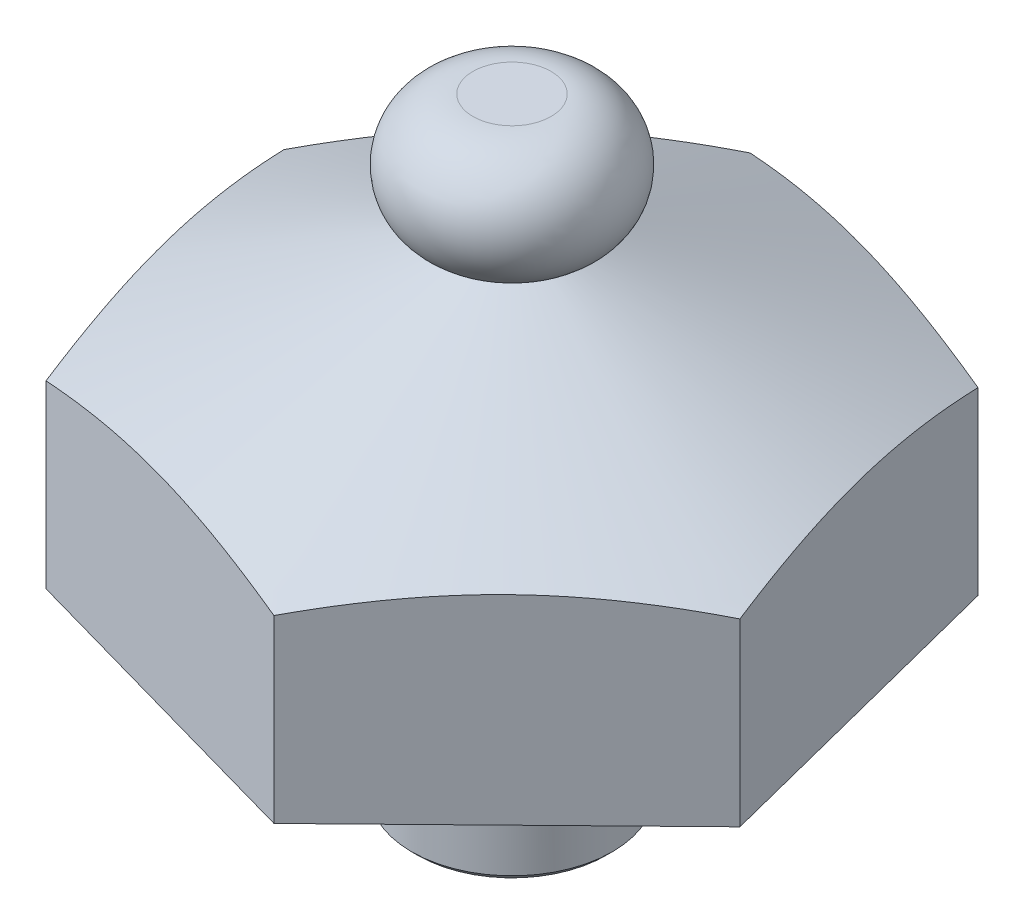
ISO-10303-21;
HEADER;
FILE_DESCRIPTION(('STEP AP214'),'2;1');
FILE_NAME('part.step','',(''),(''),'','','');
FILE_SCHEMA(('AUTOMOTIVE_DESIGN { 1 0 10303 214 1 1 1 1 }'));
ENDSEC;
DATA;
#1=APPLICATION_CONTEXT('core data for automotive mechanical design processes');
#2=APPLICATION_PROTOCOL_DEFINITION('international standard','automotive_design',2000,#1);
#3=PRODUCT_CONTEXT('',#1,'mechanical');
#4=PRODUCT('Part','Part','',(#3));
#5=PRODUCT_RELATED_PRODUCT_CATEGORY('part','',(#4));
#6=PRODUCT_DEFINITION_FORMATION('','',#4);
#7=PRODUCT_DEFINITION_CONTEXT('part definition',#1,'design');
#8=PRODUCT_DEFINITION('design','',#6,#7);
#9=PRODUCT_DEFINITION_SHAPE('','',#8);
#10=(LENGTH_UNIT() NAMED_UNIT(*) SI_UNIT(.MILLI.,.METRE.));
#11=(NAMED_UNIT(*) PLANE_ANGLE_UNIT() SI_UNIT($,.RADIAN.));
#12=(NAMED_UNIT(*) SI_UNIT($,.STERADIAN.) SOLID_ANGLE_UNIT());
#13=UNCERTAINTY_MEASURE_WITH_UNIT(LENGTH_MEASURE(1.E-05),#10,'distance_accuracy_value','');
#14=(GEOMETRIC_REPRESENTATION_CONTEXT(3) GLOBAL_UNCERTAINTY_ASSIGNED_CONTEXT((#13)) GLOBAL_UNIT_ASSIGNED_CONTEXT((#10,
#11,#12)) REPRESENTATION_CONTEXT('',''));
#15=CARTESIAN_POINT('',(0.,0.,0.));
#16=DIRECTION('',(0.,0.,1.));
#17=DIRECTION('',(1.,0.,0.));
#18=AXIS2_PLACEMENT_3D('',#15,#16,#17);
#19=CARTESIAN_POINT('',(0.,80.,0.));
#20=DIRECTION('',(0.,-1.,0.));
#21=DIRECTION('',(0.,0.,-1.));
#22=AXIS2_PLACEMENT_3D('',#19,#20,#21);
#23=CONICAL_SURFACE('',#22,6.38002773925106,1.1530604374243);
#24=CARTESIAN_POINT('',(0.,80.,0.));
#25=DIRECTION('',(0.,-1.,0.));
#26=DIRECTION('',(0.,0.,-1.));
#27=AXIS2_PLACEMENT_3D('',#24,#25,#26);
#28=CIRCLE('',#27,6.38002773925106);
#29=CARTESIAN_POINT('',(0.,80.,-6.38002773925106));
#30=VERTEX_POINT('',#29);
#31=EDGE_CURVE('E227',#30,#30,#28,.T.);
#32=ORIENTED_EDGE('',*,*,#31,.T.);
#33=EDGE_LOOP('',(#32));
#34=FACE_BOUND('',#33,.T.);
#35=CARTESIAN_POINT('',(-38.5272106001434,58.945862659129,37.5716324997342));
#36=CARTESIAN_POINT('',(-38.9490929836767,59.3254479113093,35.9141508952983));
#37=CARTESIAN_POINT('',(-39.3724986280625,59.6792666438576,34.250684739385));
#38=CARTESIAN_POINT('',(-40.2223538204007,60.32617826813,30.9117936106836));
#39=CARTESIAN_POINT('',(-40.6488049309337,60.6192372617237,29.2363624988654));
#40=CARTESIAN_POINT('',(-41.2905378575455,61.0061313484562,26.7151372419315));
#41=CARTESIAN_POINT('',(-41.5048558304006,61.1263416547713,25.8731298214454));
#42=CARTESIAN_POINT('',(-41.9340772011134,61.3480465442147,24.1868149764668));
#43=CARTESIAN_POINT('',(-42.1489805833613,61.4495416215165,23.3425076133015));
#44=CARTESIAN_POINT('',(-42.5792629747179,61.6327830320595,21.6520242553259));
#45=CARTESIAN_POINT('',(-42.794641895526,61.7145327639283,20.8058486074289));
#46=CARTESIAN_POINT('',(-43.2258161055738,61.8574299318329,19.111861493115));
#47=CARTESIAN_POINT('',(-43.4416113934293,61.9185774362494,18.2640500321369));
#48=CARTESIAN_POINT('',(-43.8693163493233,62.0185992769069,16.5836928420994));
#49=CARTESIAN_POINT('',(-44.0812201827814,62.0578826942146,15.7511700358028));
#50=CARTESIAN_POINT('',(-44.5052015381852,62.1155309799565,14.0854420399571));
#51=CARTESIAN_POINT('',(-44.7172790600562,62.1338958573776,13.2522368507014));
#52=CARTESIAN_POINT('',(-45.1414964689463,62.1494953718071,11.5855814534603));
#53=CARTESIAN_POINT('',(-45.3536363593058,62.1467285205357,10.7521312323514));
#54=CARTESIAN_POINT('',(-45.7778348695312,62.1200932568337,9.08555008374041));
#55=CARTESIAN_POINT('',(-45.9898934895394,62.0962248815149,8.25241915567942));
#56=CARTESIAN_POINT('',(-46.4136277047885,62.0276898828624,6.58766211827176));
#57=CARTESIAN_POINT('',(-46.6253034720433,61.9830406724653,5.75603533312081));
#58=CARTESIAN_POINT('',(-47.0483358324254,61.8734491335818,4.09403572663812));
#59=CARTESIAN_POINT('',(-47.2596924229431,61.8085066400702,3.2636629155589));
#60=CARTESIAN_POINT('',(-47.6819590937653,61.6590340801277,1.60467153224413));
#61=CARTESIAN_POINT('',(-47.8928692196942,61.5745061233907,0.776052780760301));
#62=CARTESIAN_POINT('',(-48.3141808831771,61.3867155858875,-0.879186592139643));
#63=CARTESIAN_POINT('',(-48.5245824209377,61.2834530127309,-1.70580721436722));
#64=CARTESIAN_POINT('',(-48.8630515157462,61.1028080806614,-3.03557664824752));
#65=CARTESIAN_POINT('',(-48.9913016616531,61.0309889055917,-3.53944281072288));
#66=CARTESIAN_POINT('',(-49.2475669088751,60.8809689973827,-4.54625169799911));
#67=CARTESIAN_POINT('',(-49.3755820232096,60.8027686293441,-5.04919447395045));
#68=CARTESIAN_POINT('',(-49.7592490464092,60.5589699993782,-6.55653646783993));
#69=CARTESIAN_POINT('',(-50.0145477094959,60.3841607363556,-7.55954786205656));
#70=CARTESIAN_POINT('',(-50.5257337131482,60.0108397917763,-9.56788343274967));
#71=CARTESIAN_POINT('',(-50.7816147071313,59.8121863595919,-10.5731826749216));
#72=CARTESIAN_POINT('',(-51.2923369001418,59.3941005248003,-12.5796960372533));
#73=CARTESIAN_POINT('',(-51.5471781244339,59.1746686302526,-13.5809102566728));
#74=CARTESIAN_POINT('',(-51.8014966610637,58.945862659129,-14.5800709530746));
#75=B_SPLINE_CURVE_WITH_KNOTS('',3,(#35,#36,#37,#38,#39,#40,#41,#42,#43,#44,#45,#46,#47,#48,#49,
#50,#51,#52,#53,#54,#55,#56,#57,#58,#59,#60,#61,#62,#63,#64,#65,#66,#67,#68,#69,#70,#71,#72,#73,
#74),.UNSPECIFIED.,.F.,.F.,(4,2,2,2,2,2,2,2,2,2,2,2,2,2,2,2,2,2,2,4),(0.,5.25635819314416,
10.5156410873764,13.1468539849881,15.7779973957511,18.4086876030479,21.0393690787711,
23.6190159843941,26.1986617817605,28.7784892618499,31.358312204748,33.9359773113769,
36.5136633801509,39.0910719164196,41.6684794058059,43.2430486531507,44.8175278744106,
47.9661787761081,51.1345729957548,54.3028897641639),.UNSPECIFIED.);
#76=CARTESIAN_POINT('',(-38.5272615065766,58.9459084604716,37.5714324997342));
#77=VERTEX_POINT('',#76);
#78=CARTESIAN_POINT('',(-51.8014457546304,58.9459084604716,-14.5798709530746));
#79=VERTEX_POINT('',#78);
#80=EDGE_CURVE('E190',#77,#79,#75,.T.);
#81=ORIENTED_EDGE('',*,*,#80,.F.);
#82=CARTESIAN_POINT('',(13.2743842480537,58.945862349794,52.1513597441757));
#83=CARTESIAN_POINT('',(11.6280218476632,59.325447624261,51.6879797942533));
#84=CARTESIAN_POINT('',(9.97571504303498,59.6792663792443,51.2229267511302));
#85=CARTESIAN_POINT('',(6.65922284210228,60.326178048083,50.2894773540706));
#86=CARTESIAN_POINT('',(4.99503134795065,60.6192370638052,49.8210792838533));
#87=CARTESIAN_POINT('',(2.49071971201957,61.0061311830484,49.116223657794));
#88=CARTESIAN_POINT('',(1.65436089187164,61.1263415001022,48.8808247516325));
#89=CARTESIAN_POINT('',(-0.0206413230385941,61.3480464106586,48.40938393017));
#90=CARTESIAN_POINT('',(-0.85928465688502,61.4495414983348,48.1733420320143));
#91=CARTESIAN_POINT('',(-2.53842742070069,61.6327829291446,47.7007358247631));
#92=CARTESIAN_POINT('',(-3.37892650608372,61.7145326709061,47.4641716126539));
#93=CARTESIAN_POINT('',(-5.06154952169107,61.8574298579931,46.9905858647497));
#94=CARTESIAN_POINT('',(-5.90367344651308,61.9185773716993,46.7535643304751));
#95=CARTESIAN_POINT('',(-7.5727579734596,62.0185992299759,46.2837890827355));
#96=CARTESIAN_POINT('',(-8.39969580659325,62.0578826556522,46.0510417777584));
#97=CARTESIAN_POINT('',(-10.0542492785345,62.1155309573745,45.5853563947649));
#98=CARTESIAN_POINT('',(-10.8818649170507,62.1338958424076,45.3524183168304));
#99=CARTESIAN_POINT('',(-12.5373395692753,62.1494953712091,44.8864736613501));
#100=CARTESIAN_POINT('',(-13.3651985960193,62.1467285266977,44.6534670801354));
#101=CARTESIAN_POINT('',(-15.0205994980274,62.1200932755863,44.1875431821576));
#102=CARTESIAN_POINT('',(-15.8481413738469,62.096224906098,43.9546258652383));
#103=CARTESIAN_POINT('',(-17.5017304018758,62.0276899181217,43.4892119315755));
#104=CARTESIAN_POINT('',(-18.3277782253559,61.9830407125732,43.2567151258983));
#105=CARTESIAN_POINT('',(-19.9786283207931,61.8734491823803,42.7920720835332));
#106=CARTESIAN_POINT('',(-20.8034305825663,61.8085066927107,42.5599258497115));
#107=CARTESIAN_POINT('',(-22.4512926356283,61.6590341394414,42.0961238122951));
#108=CARTESIAN_POINT('',(-23.2743526049627,61.5745061855358,41.8644679585882));
#109=CARTESIAN_POINT('',(-24.9184878180328,61.3867156527048,41.4017148657593));
#110=CARTESIAN_POINT('',(-25.7395630625744,61.283453081389,41.1706176264103));
#111=CARTESIAN_POINT('',(-27.060411816245,61.1028081423334,40.7988557171334));
#112=CARTESIAN_POINT('',(-27.5608978637388,61.0309889578466,40.6579904984127));
#113=CARTESIAN_POINT('',(-28.5609527156693,60.8809690287817,40.3765182252987));
#114=CARTESIAN_POINT('',(-29.0605215709134,60.8027686493046,40.2359111566054));
#115=CARTESIAN_POINT('',(-30.5577517733651,60.5589699821543,39.8145054830613));
#116=CARTESIAN_POINT('',(-31.5540346066606,60.38416069052,39.5340948703727));
#117=CARTESIAN_POINT('',(-33.5488975411298,60.0108396815907,38.9726270632501));
#118=CARTESIAN_POINT('',(-34.5474528752584,59.8121862135977,38.6915768396702));
#119=CARTESIAN_POINT('',(-36.5405058252411,59.3941003013112,38.130618465052));
#120=CARTESIAN_POINT('',(-37.5350035396895,59.1746683650792,37.8507102862635));
#121=CARTESIAN_POINT('',(-38.5274615065766,58.945862349794,37.5713762083672));
#122=B_SPLINE_CURVE_WITH_KNOTS('',3,(#82,#83,#84,#85,#86,#87,#88,#89,#90,#91,#92,#93,#94,#95,
#96,#97,#98,#99,#100,#101,#102,#103,#104,#105,#106,#107,#108,#109,#110,#111,#112,#113,#114,#115,
#116,#117,#118,#119,#120,#121),.UNSPECIFIED.,.F.,.F.,(4,2,2,2,2,2,2,2,2,2,2,2,2,2,2,2,2,2,2,4),
(0.,5.25635830769618,10.5156413167613,13.1468542725147,15.7779977414165,18.4086880068184,
21.039369540646,23.6190165000867,26.1986623512703,28.7784898851758,31.3583128818899,
33.9359780420376,36.5136641643305,39.0910727541223,41.6684802970371,43.2430497881977,
44.8175292532476,47.9661806425805,51.1345753568215,54.3028926195358),.UNSPECIFIED.);
#123=CARTESIAN_POINT('',(13.2741842480534,58.9459084604716,52.1513034528087));
#124=VERTEX_POINT('',#123);
#125=EDGE_CURVE('E152',#124,#77,#122,.T.);
#126=ORIENTED_EDGE('',*,*,#125,.F.);
#127=CARTESIAN_POINT('',(51.8016457546304,58.9458464627575,14.5796759149067));
#128=CARTESIAN_POINT('',(50.5771644903599,59.3254328818381,15.7737788272009));
#129=CARTESIAN_POINT('',(49.3482620750517,59.6792527890538,16.9721932054882));
#130=CARTESIAN_POINT('',(46.881622530518,60.3261667467572,19.377637494146));
#131=CARTESIAN_POINT('',(45.6438808659964,60.619226898973,20.5846718272959));
#132=CARTESIAN_POINT('',(43.7813002042866,61.0061226879238,22.4010434267878));
#133=CARTESIAN_POINT('',(43.159258696641,61.1263335564991,23.0076526069536));
#134=CARTESIAN_POINT('',(41.9134765235895,61.3480395513902,24.2225279703683));
#135=CARTESIAN_POINT('',(41.28973590349,61.4495351718806,24.8307941094348));
#136=CARTESIAN_POINT('',(40.0408741857815,61.6327776435671,26.0486726165895));
#137=CARTESIAN_POINT('',(39.4157533444603,61.7145278934043,26.6582847347481));
#138=CARTESIAN_POINT('',(38.1643031766357,61.8574260656734,27.878687474745));
#139=CARTESIAN_POINT('',(37.5379738541503,61.9185740564862,28.489478092665));
#140=CARTESIAN_POINT('',(36.2965929553189,62.0185968196599,29.7000613737772));
#141=CARTESIAN_POINT('',(35.6815583136,62.0578806751312,30.2998375224764));
#142=CARTESIAN_POINT('',(34.4509849054475,62.1155297975862,31.4998814376786));
#143=CARTESIAN_POINT('',(33.8354461392305,62.1338950735572,32.1001492039703));
#144=CARTESIAN_POINT('',(32.6041875901553,62.1494953404852,33.3008612623241));
#145=CARTESIAN_POINT('',(31.9884677976016,62.1467288431614,33.9013055638413));
#146=CARTESIAN_POINT('',(30.7572640880973,62.1200942386836,35.1019641431479));
#147=CARTESIAN_POINT('',(30.1417801707339,62.0962261686413,35.7021784213401));
#148=CARTESIAN_POINT('',(28.9119240345296,62.0276917289814,36.9015228595088));
#149=CARTESIAN_POINT('',(28.2975513164323,61.9830427724499,37.5006535063556));
#150=CARTESIAN_POINT('',(27.0697322552233,61.8734516885938,38.6980114076491));
#151=CARTESIAN_POINT('',(26.4562859196857,61.8085093962437,39.2962386547096));
#152=CARTESIAN_POINT('',(25.2306892079379,61.6590371857022,40.491429341166));
#153=CARTESIAN_POINT('',(24.6185386993065,61.5745093772066,41.0883929096977));
#154=CARTESIAN_POINT('',(23.395713819746,61.3867190843311,42.2808805307959));
#155=CARTESIAN_POINT('',(22.7850394482175,61.2834566075587,42.8764045839468));
#156=CARTESIAN_POINT('',(21.8026561716227,61.1028113097036,43.8344157563512));
#157=CARTESIAN_POINT('',(21.4304173208582,61.0309916415687,44.1974196737953));
#158=CARTESIAN_POINT('',(20.6866218282783,60.8809706413792,44.9227622247654));
#159=CARTESIAN_POINT('',(20.3150651486742,60.802769674434,45.2851008951426));
#160=CARTESIAN_POINT('',(19.2014931687664,60.5589690975463,46.3710460892893));
#161=CARTESIAN_POINT('',(18.4605031526908,60.3841583364558,47.0936527652714));
#162=CARTESIAN_POINT('',(16.9768144941583,60.0108340225966,48.5405323540312));
#163=CARTESIAN_POINT('',(16.2341342726476,59.8121787155238,49.2647873028709));
#164=CARTESIAN_POINT('',(14.7517918044116,59.3940888232051,50.710354099185));
#165=CARTESIAN_POINT('',(14.0121294843422,59.1746547461214,51.431666018184));
#166=CARTESIAN_POINT('',(13.2739842480537,58.9458464627575,52.1514984909767));
#167=B_SPLINE_CURVE_WITH_KNOTS('',3,(#127,#128,#129,#130,#131,#132,#133,#134,#135,#136,#137,
#138,#139,#140,#141,#142,#143,#144,#145,#146,#147,#148,#149,#150,#151,#152,#153,#154,#155,#156,
#157,#158,#159,#160,#161,#162,#163,#164,#165,#166),.UNSPECIFIED.,.F.,.F.,(4,2,2,2,2,2,2,2,2,2,2,
2,2,2,2,2,2,2,2,4),(0.,5.25636419094556,10.5156530976855,13.1468690395251,15.778015494362,
18.4087087439701,21.0393932619621,23.619042985416,26.1986916005879,28.7785218984226,
31.3583476590578,33.9360155678613,36.5137044388225,39.0911157774901,41.6685260695632,
43.2431080827545,44.8176000685118,47.9662765021035,51.1346966180105,54.303039267534),.UNSPECIFIED.);
#168=CARTESIAN_POINT('',(51.8014457546304,58.9459084604716,14.5798709530746));
#169=VERTEX_POINT('',#168);
#170=EDGE_CURVE('E104',#169,#124,#167,.T.);
#171=ORIENTED_EDGE('',*,*,#170,.F.);
#172=CARTESIAN_POINT('',(38.5272106001434,58.945862659129,-37.5716324997342));
#173=CARTESIAN_POINT('',(38.9490929836767,59.3254479113093,-35.9141508952984));
#174=CARTESIAN_POINT('',(39.3724986280625,59.6792666438576,-34.250684739385));
#175=CARTESIAN_POINT('',(40.2223538204007,60.32617826813,-30.9117936106836));
#176=CARTESIAN_POINT('',(40.6488049309337,60.6192372617237,-29.2363624988654));
#177=CARTESIAN_POINT('',(41.2905378575454,61.0061313484562,-26.7151372419315));
#178=CARTESIAN_POINT('',(41.5048558304006,61.1263416547713,-25.8731298214454));
#179=CARTESIAN_POINT('',(41.9340772011134,61.3480465442147,-24.1868149764668));
#180=CARTESIAN_POINT('',(42.1489805833613,61.4495416215165,-23.3425076133016));
#181=CARTESIAN_POINT('',(42.5792629747179,61.6327830320595,-21.6520242553259));
#182=CARTESIAN_POINT('',(42.794641895526,61.7145327639283,-20.8058486074289));
#183=CARTESIAN_POINT('',(43.2258161055738,61.8574299318329,-19.1118614931151));
#184=CARTESIAN_POINT('',(43.4416113934293,61.9185774362494,-18.264050032137));
#185=CARTESIAN_POINT('',(43.8693163493233,62.0185992769069,-16.5836928420994));
#186=CARTESIAN_POINT('',(44.0812201827814,62.0578826942146,-15.7511700358028));
#187=CARTESIAN_POINT('',(44.5052015381852,62.1155309799565,-14.0854420399572));
#188=CARTESIAN_POINT('',(44.7172790600562,62.1338958573776,-13.2522368507014));
#189=CARTESIAN_POINT('',(45.1414964689463,62.1494953718071,-11.5855814534603));
#190=CARTESIAN_POINT('',(45.3536363593058,62.1467285205357,-10.7521312323514));
#191=CARTESIAN_POINT('',(45.7778348695312,62.1200932568337,-9.08555008374044));
#192=CARTESIAN_POINT('',(45.9898934895394,62.0962248815149,-8.25241915567945));
#193=CARTESIAN_POINT('',(46.4136277047885,62.0276898828624,-6.58766211827179));
#194=CARTESIAN_POINT('',(46.6253034720433,61.9830406724653,-5.75603533312084));
#195=CARTESIAN_POINT('',(47.0483358324254,61.8734491335818,-4.09403572663815));
#196=CARTESIAN_POINT('',(47.2596924229431,61.8085066400702,-3.26366291555893));
#197=CARTESIAN_POINT('',(47.6819590937653,61.6590340801277,-1.60467153224415));
#198=CARTESIAN_POINT('',(47.8928692196942,61.5745061233907,-0.776052780760325));
#199=CARTESIAN_POINT('',(48.3141808831771,61.3867155858875,0.879186592139619));
#200=CARTESIAN_POINT('',(48.5245824209377,61.2834530127309,1.70580721436719));
#201=CARTESIAN_POINT('',(48.8630515157462,61.1028080806614,3.0355766482475));
#202=CARTESIAN_POINT('',(48.9913016616531,61.0309889055917,3.53944281072286));
#203=CARTESIAN_POINT('',(49.2475669088751,60.8809689973827,4.54625169799909));
#204=CARTESIAN_POINT('',(49.3755820232096,60.8027686293441,5.04919447395043));
#205=CARTESIAN_POINT('',(49.7592490464092,60.5589699993782,6.55653646783992));
#206=CARTESIAN_POINT('',(50.0145477094959,60.3841607363556,7.55954786205654));
#207=CARTESIAN_POINT('',(50.5257337131482,60.0108397917763,9.56788343274965));
#208=CARTESIAN_POINT('',(50.7816147071313,59.8121863595919,10.5731826749216));
#209=CARTESIAN_POINT('',(51.2923369001417,59.3941005248003,12.5796960372532));
#210=CARTESIAN_POINT('',(51.5471781244339,59.1746686302526,13.5809102566728));
#211=CARTESIAN_POINT('',(51.8014966610637,58.945862659129,14.5800709530746));
#212=B_SPLINE_CURVE_WITH_KNOTS('',3,(#172,#173,#174,#175,#176,#177,#178,#179,#180,#181,#182,
#183,#184,#185,#186,#187,#188,#189,#190,#191,#192,#193,#194,#195,#196,#197,#198,#199,#200,#201,
#202,#203,#204,#205,#206,#207,#208,#209,#210,#211),.UNSPECIFIED.,.F.,.F.,(4,2,2,2,2,2,2,2,2,2,2,
2,2,2,2,2,2,2,2,4),(0.,5.25635819314415,10.5156410873764,13.1468539849881,15.7779973957511,
18.4086876030479,21.0393690787711,23.6190159843941,26.1986617817605,28.7784892618499,
31.358312204748,33.9359773113769,36.5136633801508,39.0910719164196,41.6684794058059,
43.2430486531507,44.8175278744106,47.9661787761081,51.1345729957548,54.3028897641639),.UNSPECIFIED.);
#213=CARTESIAN_POINT('',(38.5272615065766,58.9459084604716,-37.5714324997342));
#214=VERTEX_POINT('',#213);
#215=EDGE_CURVE('E170',#214,#169,#212,.T.);
#216=ORIENTED_EDGE('',*,*,#215,.F.);
#217=CARTESIAN_POINT('',(-13.2743842480537,58.945862349794,-52.1513597441757));
#218=CARTESIAN_POINT('',(-11.6280218476632,59.325447624261,-51.6879797942533));
#219=CARTESIAN_POINT('',(-9.97571504303497,59.6792663792443,-51.2229267511302));
#220=CARTESIAN_POINT('',(-6.65922284210227,60.326178048083,-50.2894773540706));
#221=CARTESIAN_POINT('',(-4.99503134795064,60.6192370638052,-49.8210792838533));
#222=CARTESIAN_POINT('',(-2.49071971201956,61.0061311830484,-49.116223657794));
#223=CARTESIAN_POINT('',(-1.65436089187163,61.1263415001022,-48.8808247516325));
#224=CARTESIAN_POINT('',(0.020641323038601,61.3480464106586,-48.4093839301701));
#225=CARTESIAN_POINT('',(0.859284656885024,61.4495414983348,-48.1733420320143));
#226=CARTESIAN_POINT('',(2.5384274207007,61.6327829291446,-47.7007358247631));
#227=CARTESIAN_POINT('',(3.37892650608372,61.7145326709061,-47.4641716126539));
#228=CARTESIAN_POINT('',(5.06154952169107,61.8574298579931,-46.9905858647497));
#229=CARTESIAN_POINT('',(5.90367344651308,61.9185773716993,-46.7535643304751));
#230=CARTESIAN_POINT('',(7.5727579734596,62.0185992299759,-46.2837890827355));
#231=CARTESIAN_POINT('',(8.39969580659326,62.0578826556522,-46.0510417777584));
#232=CARTESIAN_POINT('',(10.0542492785345,62.1155309573745,-45.5853563947649));
#233=CARTESIAN_POINT('',(10.8818649170507,62.1338958424076,-45.3524183168304));
#234=CARTESIAN_POINT('',(12.5373395692753,62.149495371209,-44.8864736613501));
#235=CARTESIAN_POINT('',(13.3651985960193,62.1467285266977,-44.6534670801354));
#236=CARTESIAN_POINT('',(15.0205994980274,62.1200932755863,-44.1875431821576));
#237=CARTESIAN_POINT('',(15.8481413738469,62.096224906098,-43.9546258652383));
#238=CARTESIAN_POINT('',(17.5017304018758,62.0276899181217,-43.4892119315755));
#239=CARTESIAN_POINT('',(18.3277782253559,61.9830407125732,-43.2567151258984));
#240=CARTESIAN_POINT('',(19.9786283207931,61.8734491823803,-42.7920720835332));
#241=CARTESIAN_POINT('',(20.8034305825664,61.8085066927107,-42.5599258497115));
#242=CARTESIAN_POINT('',(22.4512926356283,61.6590341394415,-42.0961238122951));
#243=CARTESIAN_POINT('',(23.2743526049627,61.5745061855358,-41.8644679585882));
#244=CARTESIAN_POINT('',(24.9184878180328,61.3867156527048,-41.4017148657593));
#245=CARTESIAN_POINT('',(25.7395630625744,61.283453081389,-41.1706176264103));
#246=CARTESIAN_POINT('',(27.060411816245,61.1028081423334,-40.7988557171334));
#247=CARTESIAN_POINT('',(27.5608978637388,61.0309889578465,-40.6579904984127));
#248=CARTESIAN_POINT('',(28.5609527156694,60.8809690287817,-40.3765182252988));
#249=CARTESIAN_POINT('',(29.0605215709134,60.8027686493046,-40.2359111566054));
#250=CARTESIAN_POINT('',(30.5577517733651,60.5589699821543,-39.8145054830613));
#251=CARTESIAN_POINT('',(31.5540346066606,60.38416069052,-39.5340948703727));
#252=CARTESIAN_POINT('',(33.5488975411298,60.0108396815907,-38.9726270632501));
#253=CARTESIAN_POINT('',(34.5474528752584,59.8121862135977,-38.6915768396702));
#254=CARTESIAN_POINT('',(36.5405058252411,59.3941003013112,-38.130618465052));
#255=CARTESIAN_POINT('',(37.5350035396895,59.1746683650791,-37.8507102862635));
#256=CARTESIAN_POINT('',(38.5274615065766,58.945862349794,-37.5713762083672));
#257=B_SPLINE_CURVE_WITH_KNOTS('',3,(#217,#218,#219,#220,#221,#222,#223,#224,#225,#226,#227,
#228,#229,#230,#231,#232,#233,#234,#235,#236,#237,#238,#239,#240,#241,#242,#243,#244,#245,#246,
#247,#248,#249,#250,#251,#252,#253,#254,#255,#256),.UNSPECIFIED.,.F.,.F.,(4,2,2,2,2,2,2,2,2,2,2,
2,2,2,2,2,2,2,2,4),(0.,5.25635830769619,10.5156413167613,13.1468542725147,15.7779977414165,
18.4086880068184,21.039369540646,23.6190165000867,26.1986623512703,28.7784898851758,
31.3583128818899,33.9359780420376,36.5136641643305,39.0910727541223,41.6684802970371,
43.2430497881977,44.8175292532476,47.9661806425805,51.1345753568215,54.3028926195358),.UNSPECIFIED.);
#258=CARTESIAN_POINT('',(-13.2741842480537,58.9459084604716,-52.1513034528088));
#259=VERTEX_POINT('',#258);
#260=EDGE_CURVE('E177',#259,#214,#257,.T.);
#261=ORIENTED_EDGE('',*,*,#260,.F.);
#262=CARTESIAN_POINT('',(-51.8016457546304,58.9458464627575,-14.5796759149067));
#263=CARTESIAN_POINT('',(-50.5771644903599,59.3254328818381,-15.7737788272009));
#264=CARTESIAN_POINT('',(-49.3482620750517,59.6792527890538,-16.9721932054882));
#265=CARTESIAN_POINT('',(-46.881622530518,60.3261667467572,-19.377637494146));
#266=CARTESIAN_POINT('',(-45.6438808659964,60.619226898973,-20.5846718272959));
#267=CARTESIAN_POINT('',(-43.7813002042866,61.0061226879238,-22.4010434267878));
#268=CARTESIAN_POINT('',(-43.159258696641,61.1263335564991,-23.0076526069536));
#269=CARTESIAN_POINT('',(-41.9134765235895,61.3480395513902,-24.2225279703683));
#270=CARTESIAN_POINT('',(-41.28973590349,61.4495351718806,-24.8307941094348));
#271=CARTESIAN_POINT('',(-40.0408741857815,61.6327776435671,-26.0486726165895));
#272=CARTESIAN_POINT('',(-39.4157533444603,61.7145278934043,-26.6582847347481));
#273=CARTESIAN_POINT('',(-38.1643031766357,61.8574260656734,-27.878687474745));
#274=CARTESIAN_POINT('',(-37.5379738541503,61.9185740564862,-28.489478092665));
#275=CARTESIAN_POINT('',(-36.2965929553189,62.0185968196599,-29.7000613737772));
#276=CARTESIAN_POINT('',(-35.6815583136,62.0578806751312,-30.2998375224764));
#277=CARTESIAN_POINT('',(-34.4509849054475,62.1155297975862,-31.4998814376786));
#278=CARTESIAN_POINT('',(-33.8354461392305,62.1338950735572,-32.1001492039703));
#279=CARTESIAN_POINT('',(-32.6041875901553,62.1494953404852,-33.3008612623241));
#280=CARTESIAN_POINT('',(-31.9884677976016,62.1467288431614,-33.9013055638413));
#281=CARTESIAN_POINT('',(-30.7572640880973,62.1200942386836,-35.1019641431479));
#282=CARTESIAN_POINT('',(-30.1417801707339,62.0962261686413,-35.7021784213401));
#283=CARTESIAN_POINT('',(-28.9119240345296,62.0276917289814,-36.9015228595088));
#284=CARTESIAN_POINT('',(-28.2975513164323,61.98304277245,-37.5006535063556));
#285=CARTESIAN_POINT('',(-27.0697322552233,61.8734516885939,-38.6980114076491));
#286=CARTESIAN_POINT('',(-26.4562859196858,61.8085093962437,-39.2962386547096));
#287=CARTESIAN_POINT('',(-25.2306892079379,61.6590371857022,-40.491429341166));
#288=CARTESIAN_POINT('',(-24.6185386993066,61.5745093772066,-41.0883929096977));
#289=CARTESIAN_POINT('',(-23.395713819746,61.3867190843311,-42.2808805307959));
#290=CARTESIAN_POINT('',(-22.7850394482175,61.2834566075587,-42.8764045839468));
#291=CARTESIAN_POINT('',(-21.8026561716228,61.1028113097036,-43.8344157563512));
#292=CARTESIAN_POINT('',(-21.4304173208582,61.0309916415687,-44.1974196737952));
#293=CARTESIAN_POINT('',(-20.6866218282783,60.8809706413792,-44.9227622247653));
#294=CARTESIAN_POINT('',(-20.3150651486742,60.802769674434,-45.2851008951426));
#295=CARTESIAN_POINT('',(-19.2014931687665,60.5589690975463,-46.3710460892893));
#296=CARTESIAN_POINT('',(-18.4605031526909,60.3841583364558,-47.0936527652714));
#297=CARTESIAN_POINT('',(-16.9768144941583,60.0108340225966,-48.5405323540312));
#298=CARTESIAN_POINT('',(-16.2341342726476,59.8121787155238,-49.2647873028709));
#299=CARTESIAN_POINT('',(-14.7517918044116,59.3940888232051,-50.710354099185));
#300=CARTESIAN_POINT('',(-14.0121294843422,59.1746547461214,-51.431666018184));
#301=CARTESIAN_POINT('',(-13.2739842480537,58.9458464627575,-52.1514984909767));
#302=B_SPLINE_CURVE_WITH_KNOTS('',3,(#262,#263,#264,#265,#266,#267,#268,#269,#270,#271,#272,
#273,#274,#275,#276,#277,#278,#279,#280,#281,#282,#283,#284,#285,#286,#287,#288,#289,#290,#291,
#292,#293,#294,#295,#296,#297,#298,#299,#300,#301),.UNSPECIFIED.,.F.,.F.,(4,2,2,2,2,2,2,2,2,2,2,
2,2,2,2,2,2,2,2,4),(0.,5.25636419094555,10.5156530976855,13.1468690395251,15.778015494362,
18.4087087439701,21.0393932619621,23.619042985416,26.1986916005879,28.7785218984226,
31.3583476590577,33.9360155678613,36.5137044388225,39.0911157774901,41.6685260695632,
43.2431080827545,44.8176000685118,47.9662765021035,51.1346966180105,54.303039267534),.UNSPECIFIED.);
#303=EDGE_CURVE('E184',#79,#259,#302,.T.);
#304=ORIENTED_EDGE('',*,*,#303,.F.);
#305=EDGE_LOOP('',(#81,#126,#171,#216,#261,#304));
#306=FACE_BOUND('',#305,.T.);
#307=ADVANCED_FACE('F40',(#34,#306),#23,.T.);
#308=CARTESIAN_POINT('',(0.,100.,0.));
#309=DIRECTION('',(0.,-1.,0.));
#310=DIRECTION('',(0.,0.,-1.));
#311=AXIS2_PLACEMENT_3D('',#308,#309,#310);
#312=PLANE('',#311);
#313=CARTESIAN_POINT('',(0.,100.,0.));
#314=DIRECTION('',(0.,-1.,0.));
#315=DIRECTION('',(0.,0.,-1.));
#316=AXIS2_PLACEMENT_3D('',#313,#314,#315);
#317=CIRCLE('',#316,6.38002773925106);
#318=CARTESIAN_POINT('',(0.,100.,-6.38002773925106));
#319=VERTEX_POINT('',#318);
#320=EDGE_CURVE('E97',#319,#319,#317,.T.);
#321=ORIENTED_EDGE('',*,*,#320,.F.);
#322=EDGE_LOOP('',(#321));
#323=FACE_BOUND('',#322,.T.);
#324=ADVANCED_FACE('F136',(#323),#312,.F.);
#325=CARTESIAN_POINT('',(0.,90.,0.));
#326=DIRECTION('',(0.,-1.,0.));
#327=DIRECTION('',(0.,0.,-1.));
#328=AXIS2_PLACEMENT_3D('',#325,#326,#327);
#329=DEGENERATE_TOROIDAL_SURFACE('',#328,6.38002773925104,10.,.T.);
#330=ORIENTED_EDGE('',*,*,#31,.F.);
#331=EDGE_LOOP('',(#330));
#332=FACE_BOUND('',#331,.T.);
#333=ORIENTED_EDGE('',*,*,#320,.T.);
#334=EDGE_LOOP('',(#333));
#335=FACE_BOUND('',#334,.T.);
#336=ADVANCED_FACE('F142',(#332,#335),#329,.T.);
#337=CARTESIAN_POINT('',(-51.8014457546304,0.,-14.5798709530746));
#338=DIRECTION('',(-0.969100252306057,0.,0.246667186671307));
#339=DIRECTION('',(0.246667186671307,0.,0.969100252306057));
#340=AXIS2_PLACEMENT_3D('',#337,#338,#339);
#341=PLANE('',#340);
#342=ORIENTED_EDGE('',*,*,#80,.T.);
#343=DIRECTION('',(0.,1.,0.));
#344=VECTOR('',#343,1.);
#345=CARTESIAN_POINT('',(-51.8014457546304,0.,-14.5798709530746));
#346=LINE('',#345,#344);
#347=CARTESIAN_POINT('',(-51.8014457546304,29.5423023578363,-14.5798709530746));
#348=VERTEX_POINT('',#347);
#349=EDGE_CURVE('E310',#348,#79,#346,.T.);
#350=ORIENTED_EDGE('',*,*,#349,.F.);
#351=DIRECTION('',(0.246667186671307,0.,0.969100252306057));
#352=VECTOR('',#351,1.);
#353=CARTESIAN_POINT('',(-48.4386593144275,29.5423023578363,-1.36823453061615));
#354=LINE('',#353,#352);
#355=CARTESIAN_POINT('',(-38.5272615065763,29.5423023578363,37.5714324997343));
#356=VERTEX_POINT('',#355);
#357=EDGE_CURVE('E120',#348,#356,#354,.T.);
#358=ORIENTED_EDGE('',*,*,#357,.T.);
#359=DIRECTION('',(0.,1.,0.));
#360=VECTOR('',#359,1.);
#361=CARTESIAN_POINT('',(-38.5272615065766,0.,37.5714324997342));
#362=LINE('',#361,#360);
#363=EDGE_CURVE('E61',#356,#77,#362,.T.);
#364=ORIENTED_EDGE('',*,*,#363,.T.);
#365=EDGE_LOOP('',(#342,#350,#358,#364));
#366=FACE_BOUND('',#365,.T.);
#367=ADVANCED_FACE('F201',(#366),#341,.T.);
#368=CARTESIAN_POINT('',(-13.2741842480537,0.,-52.1513034528088));
#369=DIRECTION('',(-0.698170176090419,0.,-0.7159318439753));
#370=DIRECTION('',(-0.7159318439753,0.,0.698170176090419));
#371=AXIS2_PLACEMENT_3D('',#368,#369,#370);
#372=PLANE('',#371);
#373=ORIENTED_EDGE('',*,*,#303,.T.);
#374=DIRECTION('',(0.,1.,0.));
#375=VECTOR('',#374,1.);
#376=CARTESIAN_POINT('',(-13.2741842480537,0.,-52.1513034528088));
#377=LINE('',#376,#375);
#378=CARTESIAN_POINT('',(-13.2741842480537,29.5423023578363,-52.1513034528088));
#379=VERTEX_POINT('',#378);
#380=EDGE_CURVE('E315',#379,#259,#377,.T.);
#381=ORIENTED_EDGE('',*,*,#380,.F.);
#382=DIRECTION('',(-0.7159318439753,0.,0.698170176090419));
#383=VECTOR('',#382,1.);
#384=CARTESIAN_POINT('',(-60.120708375064,29.5423023578363,-6.46700225261356));
#385=LINE('',#384,#383);
#386=EDGE_CURVE('E118',#379,#348,#385,.T.);
#387=ORIENTED_EDGE('',*,*,#386,.T.);
#388=ORIENTED_EDGE('',*,*,#349,.T.);
#389=EDGE_LOOP('',(#373,#381,#387,#388));
#390=FACE_BOUND('',#389,.T.);
#391=ADVANCED_FACE('F197',(#390),#372,.T.);
#392=CARTESIAN_POINT('',(38.5272615065766,0.,-37.5714324997342));
#393=DIRECTION('',(0.270930076215638,0.,-0.962599030646608));
#394=DIRECTION('',(-0.962599030646608,0.,-0.270930076215638));
#395=AXIS2_PLACEMENT_3D('',#392,#393,#394);
#396=PLANE('',#395);
#397=ORIENTED_EDGE('',*,*,#260,.T.);
#398=DIRECTION('',(0.,1.,0.));
#399=VECTOR('',#398,1.);
#400=CARTESIAN_POINT('',(38.5272615065766,0.,-37.5714324997342));
#401=LINE('',#400,#399);
#402=CARTESIAN_POINT('',(38.5272615065766,29.5423023578363,-37.5714324997342));
#403=VERTEX_POINT('',#402);
#404=EDGE_CURVE('E321',#403,#214,#401,.T.);
#405=ORIENTED_EDGE('',*,*,#404,.F.);
#406=DIRECTION('',(-0.962599030646608,0.,-0.270930076215638));
#407=VECTOR('',#406,1.);
#408=CARTESIAN_POINT('',(-37.2374828402384,29.5423023578363,-58.8959376226537));
#409=LINE('',#408,#407);
#410=EDGE_CURVE('E113',#403,#379,#409,.T.);
#411=ORIENTED_EDGE('',*,*,#410,.T.);
#412=ORIENTED_EDGE('',*,*,#380,.T.);
#413=EDGE_LOOP('',(#397,#405,#411,#412));
#414=FACE_BOUND('',#413,.T.);
#415=ADVANCED_FACE('F200',(#414),#396,.T.);
#416=CARTESIAN_POINT('',(51.8014457546304,0.,14.5798709530746));
#417=DIRECTION('',(0.969100252306057,0.,-0.246667186671307));
#418=DIRECTION('',(-0.246667186671307,0.,-0.969100252306057));
#419=AXIS2_PLACEMENT_3D('',#416,#417,#418);
#420=PLANE('',#419);
#421=ORIENTED_EDGE('',*,*,#215,.T.);
#422=DIRECTION('',(0.,1.,0.));
#423=VECTOR('',#422,1.);
#424=CARTESIAN_POINT('',(51.8014457546304,0.,14.5798709530746));
#425=LINE('',#424,#423);
#426=CARTESIAN_POINT('',(51.8014457546304,29.5423023578363,14.5798709530746));
#427=VERTEX_POINT('',#426);
#428=EDGE_CURVE('E106',#427,#169,#425,.T.);
#429=ORIENTED_EDGE('',*,*,#428,.F.);
#430=DIRECTION('',(-0.246667186671307,0.,-0.969100252306057));
#431=VECTOR('',#430,1.);
#432=CARTESIAN_POINT('',(41.8900479467795,29.5423023578363,-24.3597960772757));
#433=LINE('',#432,#431);
#434=EDGE_CURVE('E111',#427,#403,#433,.T.);
#435=ORIENTED_EDGE('',*,*,#434,.T.);
#436=ORIENTED_EDGE('',*,*,#404,.T.);
#437=EDGE_LOOP('',(#421,#429,#435,#436));
#438=FACE_BOUND('',#437,.T.);
#439=ADVANCED_FACE('F205',(#438),#420,.T.);
#440=CARTESIAN_POINT('',(13.2741842480537,0.,52.1513034528088));
#441=DIRECTION('',(0.698170176090419,0.,0.7159318439753));
#442=DIRECTION('',(0.7159318439753,0.,-0.698170176090419));
#443=AXIS2_PLACEMENT_3D('',#440,#441,#442);
#444=PLANE('',#443);
#445=ORIENTED_EDGE('',*,*,#170,.T.);
#446=DIRECTION('',(0.,1.,0.));
#447=VECTOR('',#446,1.);
#448=CARTESIAN_POINT('',(13.2741842480537,0.,52.1513034528088));
#449=LINE('',#448,#447);
#450=CARTESIAN_POINT('',(13.2741842480537,29.5423023578363,52.1513034528088));
#451=VERTEX_POINT('',#450);
#452=EDGE_CURVE('E56',#451,#124,#449,.T.);
#453=ORIENTED_EDGE('',*,*,#452,.F.);
#454=DIRECTION('',(0.7159318439753,0.,-0.698170176090419));
#455=VECTOR('',#454,1.);
#456=CARTESIAN_POINT('',(4.95492162762013,29.5423023578363,60.2641721532698));
#457=LINE('',#456,#455);
#458=EDGE_CURVE('E96',#451,#427,#457,.T.);
#459=ORIENTED_EDGE('',*,*,#458,.T.);
#460=ORIENTED_EDGE('',*,*,#428,.T.);
#461=EDGE_LOOP('',(#445,#453,#459,#460));
#462=FACE_BOUND('',#461,.T.);
#463=ADVANCED_FACE('F100',(#462),#444,.T.);
#464=CARTESIAN_POINT('',(-38.5272615065766,0.,37.5714324997342));
#465=DIRECTION('',(-0.270930076215638,0.,0.962599030646608));
#466=DIRECTION('',(0.962599030646608,0.,0.270930076215638));
#467=AXIS2_PLACEMENT_3D('',#464,#465,#466);
#468=PLANE('',#467);
#469=ORIENTED_EDGE('',*,*,#125,.T.);
#470=ORIENTED_EDGE('',*,*,#363,.F.);
#471=DIRECTION('',(0.962599030646608,0.,0.270930076215638));
#472=VECTOR('',#471,1.);
#473=CARTESIAN_POINT('',(-62.4905600987613,29.5423023578363,30.8267983298893));
#474=LINE('',#473,#472);
#475=EDGE_CURVE('E91',#356,#451,#474,.T.);
#476=ORIENTED_EDGE('',*,*,#475,.T.);
#477=ORIENTED_EDGE('',*,*,#452,.T.);
#478=EDGE_LOOP('',(#469,#470,#476,#477));
#479=FACE_BOUND('',#478,.T.);
#480=ADVANCED_FACE('F92',(#479),#468,.T.);
#481=CARTESIAN_POINT('',(-16.380027739251,0.,0.));
#482=DIRECTION('',(0.,1.,0.));
#483=DIRECTION('',(0.,0.,1.));
#484=AXIS2_PLACEMENT_3D('',#481,#482,#483);
#485=PLANE('',#484);
#486=CARTESIAN_POINT('',(0.,0.,0.));
#487=DIRECTION('',(0.,1.,0.));
#488=DIRECTION('',(0.,0.,1.));
#489=AXIS2_PLACEMENT_3D('',#486,#487,#488);
#490=CIRCLE('',#489,15.380027739251);
#491=CARTESIAN_POINT('',(0.,0.,15.380027739251));
#492=VERTEX_POINT('',#491);
#493=EDGE_CURVE('E49',#492,#492,#490,.F.);
#494=ORIENTED_EDGE('',*,*,#493,.T.);
#495=EDGE_LOOP('',(#494));
#496=FACE_BOUND('',#495,.T.);
#497=ADVANCED_FACE('F124',(#496),#485,.F.);
#498=CARTESIAN_POINT('',(0.,0.,0.));
#499=DIRECTION('',(0.,-1.,0.));
#500=DIRECTION('',(0.,0.,-1.));
#501=AXIS2_PLACEMENT_3D('',#498,#499,#500);
#502=CYLINDRICAL_SURFACE('',#501,16.380027739251);
#503=CARTESIAN_POINT('',(0.,1.,0.));
#504=DIRECTION('',(0.,1.,0.));
#505=DIRECTION('',(0.,0.,1.));
#506=AXIS2_PLACEMENT_3D('',#503,#504,#505);
#507=CIRCLE('',#506,16.380027739251);
#508=CARTESIAN_POINT('',(0.,1.,16.380027739251));
#509=VERTEX_POINT('',#508);
#510=EDGE_CURVE('E12',#509,#509,#507,.T.);
#511=ORIENTED_EDGE('',*,*,#510,.T.);
#512=EDGE_LOOP('',(#511));
#513=FACE_BOUND('',#512,.T.);
#514=CARTESIAN_POINT('',(0.,29.5423023578363,0.));
#515=DIRECTION('',(0.,-1.,0.));
#516=DIRECTION('',(0.,0.,-1.));
#517=AXIS2_PLACEMENT_3D('',#514,#515,#516);
#518=CIRCLE('',#517,16.380027739251);
#519=CARTESIAN_POINT('',(0.,29.5423023578363,-16.380027739251));
#520=VERTEX_POINT('',#519);
#521=EDGE_CURVE('E226',#520,#520,#518,.T.);
#522=ORIENTED_EDGE('',*,*,#521,.T.);
#523=EDGE_LOOP('',(#522));
#524=FACE_BOUND('',#523,.T.);
#525=ADVANCED_FACE('F131',(#513,#524),#502,.T.);
#526=CARTESIAN_POINT('',(-53.8141470180305,29.5423023578363,0.));
#527=DIRECTION('',(0.,1.,0.));
#528=DIRECTION('',(0.,0.,1.));
#529=AXIS2_PLACEMENT_3D('',#526,#527,#528);
#530=PLANE('',#529);
#531=ORIENTED_EDGE('',*,*,#521,.F.);
#532=EDGE_LOOP('',(#531));
#533=FACE_BOUND('',#532,.T.);
#534=ORIENTED_EDGE('',*,*,#357,.F.);
#535=ORIENTED_EDGE('',*,*,#386,.F.);
#536=ORIENTED_EDGE('',*,*,#410,.F.);
#537=ORIENTED_EDGE('',*,*,#434,.F.);
#538=ORIENTED_EDGE('',*,*,#458,.F.);
#539=ORIENTED_EDGE('',*,*,#475,.F.);
#540=EDGE_LOOP('',(#534,#535,#536,#537,#538,#539));
#541=FACE_BOUND('',#540,.T.);
#542=ADVANCED_FACE('F109',(#533,#541),#530,.F.);
#543=CARTESIAN_POINT('',(0.,0.,0.));
#544=DIRECTION('',(0.,1.,0.));
#545=DIRECTION('',(0.,0.,1.));
#546=AXIS2_PLACEMENT_3D('',#543,#544,#545);
#547=CONICAL_SURFACE('',#546,15.380027739251,0.785398163397448);
#548=ORIENTED_EDGE('',*,*,#510,.F.);
#549=EDGE_LOOP('',(#548));
#550=FACE_BOUND('',#549,.T.);
#551=ORIENTED_EDGE('',*,*,#493,.F.);
#552=EDGE_LOOP('',(#551));
#553=FACE_BOUND('',#552,.T.);
#554=ADVANCED_FACE('F43',(#550,#553),#547,.T.);
#555=CLOSED_SHELL('',(#307,#324,#336,#367,#391,#415,#439,#463,#480,#497,#525,#542,#554));
#556=MANIFOLD_SOLID_BREP('B2',#555);
#557=ADVANCED_BREP_SHAPE_REPRESENTATION('',(#18,#556),#14);
#558=SHAPE_DEFINITION_REPRESENTATION(#9,#557);
ENDSEC;
END-ISO-10303-21;
